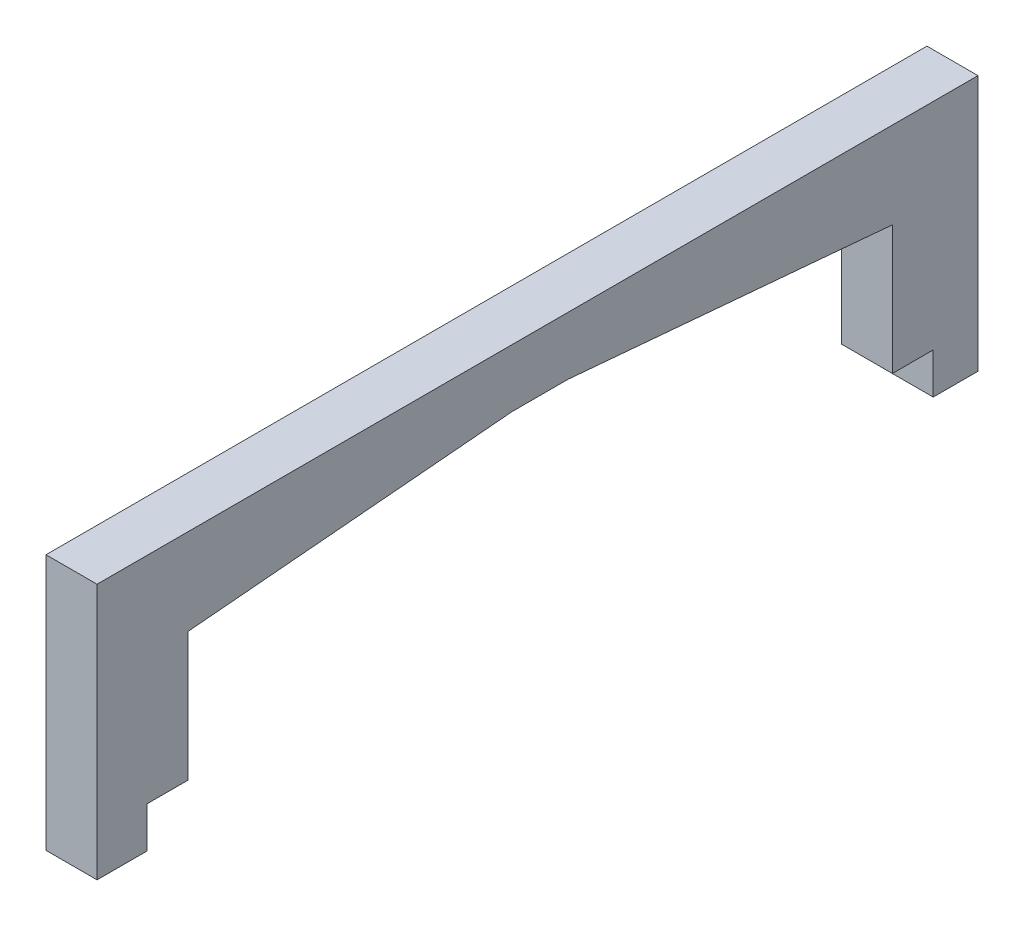
ISO-10303-21;
HEADER;
FILE_DESCRIPTION(('STEP AP214'),'2;1');
FILE_NAME('part.step','',(''),(''),'','','');
FILE_SCHEMA(('AUTOMOTIVE_DESIGN { 1 0 10303 214 1 1 1 1 }'));
ENDSEC;
DATA;
#1=APPLICATION_CONTEXT('core data for automotive mechanical design processes');
#2=APPLICATION_PROTOCOL_DEFINITION('international standard','automotive_design',2000,#1);
#3=PRODUCT_CONTEXT('',#1,'mechanical');
#4=PRODUCT('Part','Part','',(#3));
#5=PRODUCT_RELATED_PRODUCT_CATEGORY('part','',(#4));
#6=PRODUCT_DEFINITION_FORMATION('','',#4);
#7=PRODUCT_DEFINITION_CONTEXT('part definition',#1,'design');
#8=PRODUCT_DEFINITION('design','',#6,#7);
#9=PRODUCT_DEFINITION_SHAPE('','',#8);
#10=(LENGTH_UNIT() NAMED_UNIT(*) SI_UNIT(.MILLI.,.METRE.));
#11=(NAMED_UNIT(*) PLANE_ANGLE_UNIT() SI_UNIT($,.RADIAN.));
#12=(NAMED_UNIT(*) SI_UNIT($,.STERADIAN.) SOLID_ANGLE_UNIT());
#13=UNCERTAINTY_MEASURE_WITH_UNIT(LENGTH_MEASURE(1.E-05),#10,'distance_accuracy_value','');
#14=(GEOMETRIC_REPRESENTATION_CONTEXT(3) GLOBAL_UNCERTAINTY_ASSIGNED_CONTEXT((#13)) GLOBAL_UNIT_ASSIGNED_CONTEXT((#10,
#11,#12)) REPRESENTATION_CONTEXT('',''));
#15=CARTESIAN_POINT('',(0.,0.,0.));
#16=DIRECTION('',(0.,0.,1.));
#17=DIRECTION('',(1.,0.,0.));
#18=AXIS2_PLACEMENT_3D('',#15,#16,#17);
#19=CARTESIAN_POINT('',(10.,-3.94802521709064,-69.5));
#20=DIRECTION('',(0.,0.,-1.));
#21=DIRECTION('',(-1.,0.,0.));
#22=AXIS2_PLACEMENT_3D('',#19,#20,#21);
#23=PLANE('',#22);
#24=DIRECTION('',(0.,-1.,0.));
#25=VECTOR('',#24,1.);
#26=CARTESIAN_POINT('',(0.,-3.94802521709064,-69.5));
#27=LINE('',#26,#25);
#28=CARTESIAN_POINT('',(0.,-3.94802521709064,-69.5));
#29=VERTEX_POINT('',#28);
#30=CARTESIAN_POINT('',(0.,-29.1698596347352,-69.5));
#31=VERTEX_POINT('',#30);
#32=EDGE_CURVE('E167',#29,#31,#27,.T.);
#33=ORIENTED_EDGE('',*,*,#32,.T.);
#34=DIRECTION('',(-1.,0.,0.));
#35=VECTOR('',#34,1.);
#36=CARTESIAN_POINT('',(10.,-29.1698596347352,-69.5));
#37=LINE('',#36,#35);
#38=CARTESIAN_POINT('',(10.,-29.1698596347352,-69.5));
#39=VERTEX_POINT('',#38);
#40=EDGE_CURVE('E11',#39,#31,#37,.T.);
#41=ORIENTED_EDGE('',*,*,#40,.F.);
#42=DIRECTION('',(0.,-1.,0.));
#43=VECTOR('',#42,1.);
#44=CARTESIAN_POINT('',(10.,-3.94802521709064,-69.5));
#45=LINE('',#44,#43);
#46=CARTESIAN_POINT('',(10.,-3.94802521709064,-69.5));
#47=VERTEX_POINT('',#46);
#48=EDGE_CURVE('E193',#47,#39,#45,.T.);
#49=ORIENTED_EDGE('',*,*,#48,.F.);
#50=DIRECTION('',(-1.,0.,0.));
#51=VECTOR('',#50,1.);
#52=CARTESIAN_POINT('',(10.,-3.94802521709064,-69.5));
#53=LINE('',#52,#51);
#54=EDGE_CURVE('E163',#47,#29,#53,.T.);
#55=ORIENTED_EDGE('',*,*,#54,.T.);
#56=EDGE_LOOP('',(#33,#41,#49,#55));
#57=FACE_BOUND('',#56,.T.);
#58=ADVANCED_FACE('F35',(#57),#23,.F.);
#59=CARTESIAN_POINT('',(10.,-29.1698596347352,-69.5));
#60=DIRECTION('',(0.,1.,0.));
#61=DIRECTION('',(0.,0.,1.));
#62=AXIS2_PLACEMENT_3D('',#59,#60,#61);
#63=PLANE('',#62);
#64=DIRECTION('',(0.,0.,-1.));
#65=VECTOR('',#64,1.);
#66=CARTESIAN_POINT('',(0.,-29.1698596347352,-69.5));
#67=LINE('',#66,#65);
#68=CARTESIAN_POINT('',(0.,-29.1698596347352,-77.5));
#69=VERTEX_POINT('',#68);
#70=EDGE_CURVE('E170',#31,#69,#67,.T.);
#71=ORIENTED_EDGE('',*,*,#70,.T.);
#72=DIRECTION('',(-1.,0.,0.));
#73=VECTOR('',#72,1.);
#74=CARTESIAN_POINT('',(10.,-29.1698596347352,-77.5));
#75=LINE('',#74,#73);
#76=CARTESIAN_POINT('',(10.,-29.1698596347352,-77.5));
#77=VERTEX_POINT('',#76);
#78=EDGE_CURVE('E43',#77,#69,#75,.T.);
#79=ORIENTED_EDGE('',*,*,#78,.F.);
#80=DIRECTION('',(0.,0.,-1.));
#81=VECTOR('',#80,1.);
#82=CARTESIAN_POINT('',(10.,-29.1698596347352,-69.5));
#83=LINE('',#82,#81);
#84=EDGE_CURVE('E111',#39,#77,#83,.T.);
#85=ORIENTED_EDGE('',*,*,#84,.F.);
#86=ORIENTED_EDGE('',*,*,#40,.T.);
#87=EDGE_LOOP('',(#71,#79,#85,#86));
#88=FACE_BOUND('',#87,.T.);
#89=ADVANCED_FACE('F281',(#88),#63,.F.);
#90=CARTESIAN_POINT('',(10.,-37.1730362447352,-77.5));
#91=DIRECTION('',(0.,0.,-1.));
#92=DIRECTION('',(-1.,0.,0.));
#93=AXIS2_PLACEMENT_3D('',#90,#91,#92);
#94=PLANE('',#93);
#95=DIRECTION('',(0.,-1.,0.));
#96=VECTOR('',#95,1.);
#97=CARTESIAN_POINT('',(0.,-37.1730362447352,-77.5));
#98=LINE('',#97,#96);
#99=CARTESIAN_POINT('',(0.,-37.1730362447352,-77.5));
#100=VERTEX_POINT('',#99);
#101=EDGE_CURVE('E172',#69,#100,#98,.T.);
#102=ORIENTED_EDGE('',*,*,#101,.T.);
#103=DIRECTION('',(-1.,0.,0.));
#104=VECTOR('',#103,1.);
#105=CARTESIAN_POINT('',(10.,-37.1730362447352,-77.5));
#106=LINE('',#105,#104);
#107=CARTESIAN_POINT('',(10.,-37.1730362447352,-77.5));
#108=VERTEX_POINT('',#107);
#109=EDGE_CURVE('E218',#108,#100,#106,.T.);
#110=ORIENTED_EDGE('',*,*,#109,.F.);
#111=DIRECTION('',(0.,-1.,0.));
#112=VECTOR('',#111,1.);
#113=CARTESIAN_POINT('',(10.,-37.1730362447352,-77.5));
#114=LINE('',#113,#112);
#115=EDGE_CURVE('E226',#77,#108,#114,.T.);
#116=ORIENTED_EDGE('',*,*,#115,.F.);
#117=ORIENTED_EDGE('',*,*,#78,.T.);
#118=EDGE_LOOP('',(#102,#110,#116,#117));
#119=FACE_BOUND('',#118,.T.);
#120=ADVANCED_FACE('F224',(#119),#94,.F.);
#121=CARTESIAN_POINT('',(10.,-37.1730362447352,-86.2713902605137));
#122=DIRECTION('',(0.,1.,0.));
#123=DIRECTION('',(0.,0.,1.));
#124=AXIS2_PLACEMENT_3D('',#121,#122,#123);
#125=PLANE('',#124);
#126=DIRECTION('',(0.,0.,-1.));
#127=VECTOR('',#126,1.);
#128=CARTESIAN_POINT('',(0.,-37.1730362447352,-86.2713902605137));
#129=LINE('',#128,#127);
#130=CARTESIAN_POINT('',(0.,-37.1730362447352,-86.2713902605137));
#131=VERTEX_POINT('',#130);
#132=EDGE_CURVE('E174',#100,#131,#129,.T.);
#133=ORIENTED_EDGE('',*,*,#132,.T.);
#134=DIRECTION('',(-1.,0.,0.));
#135=VECTOR('',#134,1.);
#136=CARTESIAN_POINT('',(10.,-37.1730362447352,-86.2713902605137));
#137=LINE('',#136,#135);
#138=CARTESIAN_POINT('',(10.,-37.1730362447352,-86.2713902605137));
#139=VERTEX_POINT('',#138);
#140=EDGE_CURVE('E215',#139,#131,#137,.T.);
#141=ORIENTED_EDGE('',*,*,#140,.F.);
#142=DIRECTION('',(0.,0.,-1.));
#143=VECTOR('',#142,1.);
#144=CARTESIAN_POINT('',(10.,-37.1730362447352,-86.2713902605137));
#145=LINE('',#144,#143);
#146=EDGE_CURVE('E244',#108,#139,#145,.T.);
#147=ORIENTED_EDGE('',*,*,#146,.F.);
#148=ORIENTED_EDGE('',*,*,#109,.T.);
#149=EDGE_LOOP('',(#133,#141,#147,#148));
#150=FACE_BOUND('',#149,.T.);
#151=ADVANCED_FACE('F235',(#150),#125,.F.);
#152=CARTESIAN_POINT('',(10.,-37.1730362447352,-86.2713902605137));
#153=DIRECTION('',(0.,0.,1.));
#154=DIRECTION('',(1.,0.,0.));
#155=AXIS2_PLACEMENT_3D('',#152,#153,#154);
#156=PLANE('',#155);
#157=DIRECTION('',(0.,1.,0.));
#158=VECTOR('',#157,1.);
#159=CARTESIAN_POINT('',(0.,-37.1730362447352,-86.2713902605137));
#160=LINE('',#159,#158);
#161=CARTESIAN_POINT('',(0.,12.9759163285897,-86.2713902605137));
#162=VERTEX_POINT('',#161);
#163=EDGE_CURVE('E176',#131,#162,#160,.T.);
#164=ORIENTED_EDGE('',*,*,#163,.T.);
#165=DIRECTION('',(-1.,0.,0.));
#166=VECTOR('',#165,1.);
#167=CARTESIAN_POINT('',(10.,12.9759163285897,-86.2713902605137));
#168=LINE('',#167,#166);
#169=CARTESIAN_POINT('',(10.,12.9759163285897,-86.2713902605137));
#170=VERTEX_POINT('',#169);
#171=EDGE_CURVE('E212',#170,#162,#168,.T.);
#172=ORIENTED_EDGE('',*,*,#171,.F.);
#173=DIRECTION('',(0.,1.,0.));
#174=VECTOR('',#173,1.);
#175=CARTESIAN_POINT('',(10.,-37.1730362447352,-86.2713902605137));
#176=LINE('',#175,#174);
#177=EDGE_CURVE('E241',#139,#170,#176,.T.);
#178=ORIENTED_EDGE('',*,*,#177,.F.);
#179=ORIENTED_EDGE('',*,*,#140,.T.);
#180=EDGE_LOOP('',(#164,#172,#178,#179));
#181=FACE_BOUND('',#180,.T.);
#182=ADVANCED_FACE('F239',(#181),#156,.F.);
#183=CARTESIAN_POINT('',(10.,12.9759163285897,-86.2713902605137));
#184=DIRECTION('',(0.,-1.,0.));
#185=DIRECTION('',(0.,0.,-1.));
#186=AXIS2_PLACEMENT_3D('',#183,#184,#185);
#187=PLANE('',#186);
#188=DIRECTION('',(0.,0.,1.));
#189=VECTOR('',#188,1.);
#190=CARTESIAN_POINT('',(0.,12.9759163285897,-86.2713902605137));
#191=LINE('',#190,#189);
#192=CARTESIAN_POINT('',(0.,12.9759163285897,86.2713902605137));
#193=VERTEX_POINT('',#192);
#194=EDGE_CURVE('E178',#162,#193,#191,.T.);
#195=ORIENTED_EDGE('',*,*,#194,.T.);
#196=DIRECTION('',(-1.,0.,0.));
#197=VECTOR('',#196,1.);
#198=CARTESIAN_POINT('',(10.,12.9759163285897,86.2713902605137));
#199=LINE('',#198,#197);
#200=CARTESIAN_POINT('',(10.,12.9759163285897,86.2713902605137));
#201=VERTEX_POINT('',#200);
#202=EDGE_CURVE('E209',#201,#193,#199,.T.);
#203=ORIENTED_EDGE('',*,*,#202,.F.);
#204=DIRECTION('',(0.,0.,1.));
#205=VECTOR('',#204,1.);
#206=CARTESIAN_POINT('',(10.,12.9759163285897,-86.2713902605137));
#207=LINE('',#206,#205);
#208=EDGE_CURVE('E243',#170,#201,#207,.T.);
#209=ORIENTED_EDGE('',*,*,#208,.F.);
#210=ORIENTED_EDGE('',*,*,#171,.T.);
#211=EDGE_LOOP('',(#195,#203,#209,#210));
#212=FACE_BOUND('',#211,.T.);
#213=ADVANCED_FACE('F294',(#212),#187,.F.);
#214=CARTESIAN_POINT('',(10.,-37.1730362447352,86.2713902605137));
#215=DIRECTION('',(0.,0.,-1.));
#216=DIRECTION('',(-1.,0.,0.));
#217=AXIS2_PLACEMENT_3D('',#214,#215,#216);
#218=PLANE('',#217);
#219=DIRECTION('',(0.,-1.,0.));
#220=VECTOR('',#219,1.);
#221=CARTESIAN_POINT('',(0.,-37.1730362447352,86.2713902605137));
#222=LINE('',#221,#220);
#223=CARTESIAN_POINT('',(0.,-37.1730362447352,86.2713902605137));
#224=VERTEX_POINT('',#223);
#225=EDGE_CURVE('E180',#193,#224,#222,.T.);
#226=ORIENTED_EDGE('',*,*,#225,.T.);
#227=DIRECTION('',(-1.,0.,0.));
#228=VECTOR('',#227,1.);
#229=CARTESIAN_POINT('',(10.,-37.1730362447352,86.2713902605137));
#230=LINE('',#229,#228);
#231=CARTESIAN_POINT('',(10.,-37.1730362447352,86.2713902605137));
#232=VERTEX_POINT('',#231);
#233=EDGE_CURVE('E206',#232,#224,#230,.T.);
#234=ORIENTED_EDGE('',*,*,#233,.F.);
#235=DIRECTION('',(0.,-1.,0.));
#236=VECTOR('',#235,1.);
#237=CARTESIAN_POINT('',(10.,-37.1730362447352,86.2713902605137));
#238=LINE('',#237,#236);
#239=EDGE_CURVE('E246',#201,#232,#238,.T.);
#240=ORIENTED_EDGE('',*,*,#239,.F.);
#241=ORIENTED_EDGE('',*,*,#202,.T.);
#242=EDGE_LOOP('',(#226,#234,#240,#241));
#243=FACE_BOUND('',#242,.T.);
#244=ADVANCED_FACE('F297',(#243),#218,.F.);
#245=CARTESIAN_POINT('',(10.,-37.1730362447352,76.5));
#246=DIRECTION('',(0.,1.,0.));
#247=DIRECTION('',(0.,0.,1.));
#248=AXIS2_PLACEMENT_3D('',#245,#246,#247);
#249=PLANE('',#248);
#250=DIRECTION('',(0.,0.,-1.));
#251=VECTOR('',#250,1.);
#252=CARTESIAN_POINT('',(0.,-37.1730362447352,76.5));
#253=LINE('',#252,#251);
#254=CARTESIAN_POINT('',(0.,-37.1730362447352,76.5));
#255=VERTEX_POINT('',#254);
#256=EDGE_CURVE('E182',#224,#255,#253,.T.);
#257=ORIENTED_EDGE('',*,*,#256,.T.);
#258=DIRECTION('',(-1.,0.,0.));
#259=VECTOR('',#258,1.);
#260=CARTESIAN_POINT('',(10.,-37.1730362447352,76.5));
#261=LINE('',#260,#259);
#262=CARTESIAN_POINT('',(10.,-37.1730362447352,76.5));
#263=VERTEX_POINT('',#262);
#264=EDGE_CURVE('E203',#263,#255,#261,.T.);
#265=ORIENTED_EDGE('',*,*,#264,.F.);
#266=DIRECTION('',(0.,0.,-1.));
#267=VECTOR('',#266,1.);
#268=CARTESIAN_POINT('',(10.,-37.1730362447352,76.5));
#269=LINE('',#268,#267);
#270=EDGE_CURVE('E252',#232,#263,#269,.T.);
#271=ORIENTED_EDGE('',*,*,#270,.F.);
#272=ORIENTED_EDGE('',*,*,#233,.T.);
#273=EDGE_LOOP('',(#257,#265,#271,#272));
#274=FACE_BOUND('',#273,.T.);
#275=ADVANCED_FACE('F301',(#274),#249,.F.);
#276=CARTESIAN_POINT('',(10.,-37.1730362447352,76.5));
#277=DIRECTION('',(0.,0.,1.));
#278=DIRECTION('',(0.,-1.,0.));
#279=AXIS2_PLACEMENT_3D('',#276,#277,#278);
#280=PLANE('',#279);
#281=DIRECTION('',(0.,1.,0.));
#282=VECTOR('',#281,1.);
#283=CARTESIAN_POINT('',(0.,-37.1730362447352,76.5));
#284=LINE('',#283,#282);
#285=CARTESIAN_POINT('',(0.,-29.1698596347352,76.5));
#286=VERTEX_POINT('',#285);
#287=EDGE_CURVE('E184',#255,#286,#284,.T.);
#288=ORIENTED_EDGE('',*,*,#287,.T.);
#289=DIRECTION('',(-1.,0.,0.));
#290=VECTOR('',#289,1.);
#291=CARTESIAN_POINT('',(10.,-29.1698596347352,76.5));
#292=LINE('',#291,#290);
#293=CARTESIAN_POINT('',(10.,-29.1698596347352,76.5));
#294=VERTEX_POINT('',#293);
#295=EDGE_CURVE('E200',#294,#286,#292,.T.);
#296=ORIENTED_EDGE('',*,*,#295,.F.);
#297=DIRECTION('',(0.,1.,0.));
#298=VECTOR('',#297,1.);
#299=CARTESIAN_POINT('',(10.,-37.1730362447352,76.5));
#300=LINE('',#299,#298);
#301=EDGE_CURVE('E254',#263,#294,#300,.T.);
#302=ORIENTED_EDGE('',*,*,#301,.F.);
#303=ORIENTED_EDGE('',*,*,#264,.T.);
#304=EDGE_LOOP('',(#288,#296,#302,#303));
#305=FACE_BOUND('',#304,.T.);
#306=ADVANCED_FACE('F305',(#305),#280,.F.);
#307=CARTESIAN_POINT('',(10.,-29.1698596347352,76.5));
#308=DIRECTION('',(0.,1.,0.));
#309=DIRECTION('',(0.,0.,1.));
#310=AXIS2_PLACEMENT_3D('',#307,#308,#309);
#311=PLANE('',#310);
#312=DIRECTION('',(0.,0.,-1.));
#313=VECTOR('',#312,1.);
#314=CARTESIAN_POINT('',(0.,-29.1698596347352,76.5));
#315=LINE('',#314,#313);
#316=CARTESIAN_POINT('',(0.,-29.1698596347352,68.5));
#317=VERTEX_POINT('',#316);
#318=EDGE_CURVE('E186',#286,#317,#315,.T.);
#319=ORIENTED_EDGE('',*,*,#318,.T.);
#320=DIRECTION('',(-1.,0.,0.));
#321=VECTOR('',#320,1.);
#322=CARTESIAN_POINT('',(10.,-29.1698596347352,68.5));
#323=LINE('',#322,#321);
#324=CARTESIAN_POINT('',(10.,-29.1698596347352,68.5));
#325=VERTEX_POINT('',#324);
#326=EDGE_CURVE('E197',#325,#317,#323,.T.);
#327=ORIENTED_EDGE('',*,*,#326,.F.);
#328=DIRECTION('',(0.,0.,-1.));
#329=VECTOR('',#328,1.);
#330=CARTESIAN_POINT('',(10.,-29.1698596347352,76.5));
#331=LINE('',#330,#329);
#332=EDGE_CURVE('E256',#294,#325,#331,.T.);
#333=ORIENTED_EDGE('',*,*,#332,.F.);
#334=ORIENTED_EDGE('',*,*,#295,.T.);
#335=EDGE_LOOP('',(#319,#327,#333,#334));
#336=FACE_BOUND('',#335,.T.);
#337=ADVANCED_FACE('F262',(#336),#311,.F.);
#338=CARTESIAN_POINT('',(10.,-3.94802521709065,68.5));
#339=DIRECTION('',(0.,0.,1.));
#340=DIRECTION('',(1.,0.,0.));
#341=AXIS2_PLACEMENT_3D('',#338,#339,#340);
#342=PLANE('',#341);
#343=DIRECTION('',(0.,1.,0.));
#344=VECTOR('',#343,1.);
#345=CARTESIAN_POINT('',(0.,-3.94802521709065,68.5));
#346=LINE('',#345,#344);
#347=CARTESIAN_POINT('',(0.,-3.94802521709065,68.5));
#348=VERTEX_POINT('',#347);
#349=EDGE_CURVE('E188',#317,#348,#346,.T.);
#350=ORIENTED_EDGE('',*,*,#349,.T.);
#351=DIRECTION('',(-1.,0.,0.));
#352=VECTOR('',#351,1.);
#353=CARTESIAN_POINT('',(10.,-3.94802521709065,68.5));
#354=LINE('',#353,#352);
#355=CARTESIAN_POINT('',(10.,-3.94802521709065,68.5));
#356=VERTEX_POINT('',#355);
#357=EDGE_CURVE('E158',#356,#348,#354,.T.);
#358=ORIENTED_EDGE('',*,*,#357,.F.);
#359=DIRECTION('',(0.,1.,0.));
#360=VECTOR('',#359,1.);
#361=CARTESIAN_POINT('',(10.,-3.94802521709065,68.5));
#362=LINE('',#361,#360);
#363=EDGE_CURVE('E148',#325,#356,#362,.T.);
#364=ORIENTED_EDGE('',*,*,#363,.F.);
#365=ORIENTED_EDGE('',*,*,#326,.T.);
#366=EDGE_LOOP('',(#350,#358,#364,#365));
#367=FACE_BOUND('',#366,.T.);
#368=ADVANCED_FACE('F266',(#367),#342,.F.);
#369=CARTESIAN_POINT('',(10.,1.60941483557722,4.97816952854575));
#370=DIRECTION('',(0.,0.996194698091746,0.0871557427476585));
#371=DIRECTION('',(0.,-0.0871557427476585,0.996194698091746));
#372=AXIS2_PLACEMENT_3D('',#369,#370,#371);
#373=PLANE('',#372);
#374=DIRECTION('',(0.,0.0871557427476584,-0.996194698091745));
#375=VECTOR('',#374,1.);
#376=CARTESIAN_POINT('',(0.,1.60941483557722,4.97816952854575));
#377=LINE('',#376,#375);
#378=CARTESIAN_POINT('',(0.,1.60941483557722,4.97816952854575));
#379=VERTEX_POINT('',#378);
#380=EDGE_CURVE('E157',#348,#379,#377,.T.);
#381=ORIENTED_EDGE('',*,*,#380,.T.);
#382=DIRECTION('',(-1.,0.,0.));
#383=VECTOR('',#382,1.);
#384=CARTESIAN_POINT('',(10.,1.60941483557722,4.97816952854575));
#385=LINE('',#384,#383);
#386=CARTESIAN_POINT('',(10.,1.60941483557722,4.97816952854575));
#387=VERTEX_POINT('',#386);
#388=EDGE_CURVE('E154',#387,#379,#385,.T.);
#389=ORIENTED_EDGE('',*,*,#388,.F.);
#390=DIRECTION('',(0.,0.0871557427476584,-0.996194698091745));
#391=VECTOR('',#390,1.);
#392=CARTESIAN_POINT('',(10.,1.60941483557722,4.97816952854575));
#393=LINE('',#392,#391);
#394=EDGE_CURVE('E142',#356,#387,#393,.T.);
#395=ORIENTED_EDGE('',*,*,#394,.F.);
#396=ORIENTED_EDGE('',*,*,#357,.T.);
#397=EDGE_LOOP('',(#381,#389,#395,#396));
#398=FACE_BOUND('',#397,.T.);
#399=ADVANCED_FACE('F155',(#398),#373,.F.);
#400=CARTESIAN_POINT('',(10.,1.60941483557722,-5.97816952854575));
#401=DIRECTION('',(0.,1.,0.));
#402=DIRECTION('',(0.,0.,1.));
#403=AXIS2_PLACEMENT_3D('',#400,#401,#402);
#404=PLANE('',#403);
#405=DIRECTION('',(0.,0.,-1.));
#406=VECTOR('',#405,1.);
#407=CARTESIAN_POINT('',(0.,1.60941483557722,-5.97816952854575));
#408=LINE('',#407,#406);
#409=CARTESIAN_POINT('',(0.,1.60941483557722,-5.97816952854575));
#410=VERTEX_POINT('',#409);
#411=EDGE_CURVE('E97',#379,#410,#408,.T.);
#412=ORIENTED_EDGE('',*,*,#411,.T.);
#413=DIRECTION('',(-1.,0.,0.));
#414=VECTOR('',#413,1.);
#415=CARTESIAN_POINT('',(10.,1.60941483557722,-5.97816952854575));
#416=LINE('',#415,#414);
#417=CARTESIAN_POINT('',(10.,1.60941483557722,-5.97816952854575));
#418=VERTEX_POINT('',#417);
#419=EDGE_CURVE('E159',#418,#410,#416,.T.);
#420=ORIENTED_EDGE('',*,*,#419,.F.);
#421=DIRECTION('',(0.,0.,-1.));
#422=VECTOR('',#421,1.);
#423=CARTESIAN_POINT('',(10.,1.60941483557722,4.97816952854575));
#424=LINE('',#423,#422);
#425=EDGE_CURVE('E146',#387,#418,#424,.T.);
#426=ORIENTED_EDGE('',*,*,#425,.F.);
#427=ORIENTED_EDGE('',*,*,#388,.T.);
#428=EDGE_LOOP('',(#412,#420,#426,#427));
#429=FACE_BOUND('',#428,.T.);
#430=ADVANCED_FACE('F161',(#429),#404,.F.);
#431=CARTESIAN_POINT('',(10.,1.60941483557722,-5.97816952854575));
#432=DIRECTION('',(0.,0.996194698091746,-0.0871557427476582));
#433=DIRECTION('',(0.,0.0871557427476582,0.996194698091746));
#434=AXIS2_PLACEMENT_3D('',#431,#432,#433);
#435=PLANE('',#434);
#436=DIRECTION('',(0.,-0.0871557427476582,-0.996194698091745));
#437=VECTOR('',#436,1.);
#438=CARTESIAN_POINT('',(0.,1.60941483557722,-5.97816952854575));
#439=LINE('',#438,#437);
#440=EDGE_CURVE('E103',#410,#29,#439,.T.);
#441=ORIENTED_EDGE('',*,*,#440,.T.);
#442=ORIENTED_EDGE('',*,*,#54,.F.);
#443=DIRECTION('',(0.,-0.0871557427476582,-0.996194698091745));
#444=VECTOR('',#443,1.);
#445=CARTESIAN_POINT('',(10.,1.60941483557722,-5.97816952854575));
#446=LINE('',#445,#444);
#447=EDGE_CURVE('E51',#418,#47,#446,.T.);
#448=ORIENTED_EDGE('',*,*,#447,.F.);
#449=ORIENTED_EDGE('',*,*,#419,.T.);
#450=EDGE_LOOP('',(#441,#442,#448,#449));
#451=FACE_BOUND('',#450,.T.);
#452=ADVANCED_FACE('F270',(#451),#435,.F.);
#453=CARTESIAN_POINT('',(10.,0.,0.));
#454=DIRECTION('',(1.,0.,0.));
#455=DIRECTION('',(0.,0.,-1.));
#456=AXIS2_PLACEMENT_3D('',#453,#454,#455);
#457=PLANE('',#456);
#458=ORIENTED_EDGE('',*,*,#48,.T.);
#459=ORIENTED_EDGE('',*,*,#84,.T.);
#460=ORIENTED_EDGE('',*,*,#115,.T.);
#461=ORIENTED_EDGE('',*,*,#146,.T.);
#462=ORIENTED_EDGE('',*,*,#177,.T.);
#463=ORIENTED_EDGE('',*,*,#208,.T.);
#464=ORIENTED_EDGE('',*,*,#239,.T.);
#465=ORIENTED_EDGE('',*,*,#270,.T.);
#466=ORIENTED_EDGE('',*,*,#301,.T.);
#467=ORIENTED_EDGE('',*,*,#332,.T.);
#468=ORIENTED_EDGE('',*,*,#363,.T.);
#469=ORIENTED_EDGE('',*,*,#394,.T.);
#470=ORIENTED_EDGE('',*,*,#425,.T.);
#471=ORIENTED_EDGE('',*,*,#447,.T.);
#472=EDGE_LOOP('',(#458,#459,#460,#461,#462,#463,#464,#465,#466,#467,#468,#469,#470,#471));
#473=FACE_BOUND('',#472,.T.);
#474=ADVANCED_FACE('F144',(#473),#457,.T.);
#475=CARTESIAN_POINT('',(0.,0.,0.));
#476=DIRECTION('',(1.,0.,0.));
#477=DIRECTION('',(0.,0.,-1.));
#478=AXIS2_PLACEMENT_3D('',#475,#476,#477);
#479=PLANE('',#478);
#480=ORIENTED_EDGE('',*,*,#32,.F.);
#481=ORIENTED_EDGE('',*,*,#440,.F.);
#482=ORIENTED_EDGE('',*,*,#411,.F.);
#483=ORIENTED_EDGE('',*,*,#380,.F.);
#484=ORIENTED_EDGE('',*,*,#349,.F.);
#485=ORIENTED_EDGE('',*,*,#318,.F.);
#486=ORIENTED_EDGE('',*,*,#287,.F.);
#487=ORIENTED_EDGE('',*,*,#256,.F.);
#488=ORIENTED_EDGE('',*,*,#225,.F.);
#489=ORIENTED_EDGE('',*,*,#194,.F.);
#490=ORIENTED_EDGE('',*,*,#163,.F.);
#491=ORIENTED_EDGE('',*,*,#132,.F.);
#492=ORIENTED_EDGE('',*,*,#101,.F.);
#493=ORIENTED_EDGE('',*,*,#70,.F.);
#494=EDGE_LOOP('',(#480,#481,#482,#483,#484,#485,#486,#487,#488,#489,#490,#491,#492,#493));
#495=FACE_BOUND('',#494,.T.);
#496=ADVANCED_FACE('F230',(#495),#479,.F.);
#497=CLOSED_SHELL('',(#58,#89,#120,#151,#182,#213,#244,#275,#306,#337,#368,#399,#430,#452,#474,#496));
#498=MANIFOLD_SOLID_BREP('B2',#497);
#499=ADVANCED_BREP_SHAPE_REPRESENTATION('',(#18,#498),#14);
#500=SHAPE_DEFINITION_REPRESENTATION(#9,#499);
ENDSEC;
END-ISO-10303-21;
